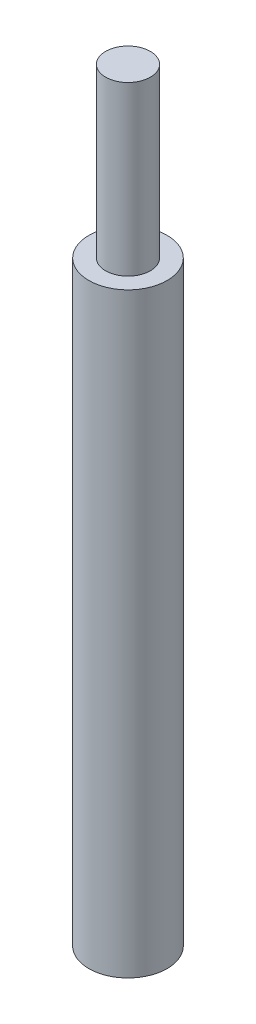
ISO-10303-21;
HEADER;
FILE_DESCRIPTION(('STEP AP214'),'2;1');
FILE_NAME('part.step','',(''),(''),'','','');
FILE_SCHEMA(('AUTOMOTIVE_DESIGN { 1 0 10303 214 1 1 1 1 }'));
ENDSEC;
DATA;
#1=APPLICATION_CONTEXT('core data for automotive mechanical design processes');
#2=APPLICATION_PROTOCOL_DEFINITION('international standard','automotive_design',2000,#1);
#3=PRODUCT_CONTEXT('',#1,'mechanical');
#4=PRODUCT('Part','Part','',(#3));
#5=PRODUCT_RELATED_PRODUCT_CATEGORY('part','',(#4));
#6=PRODUCT_DEFINITION_FORMATION('','',#4);
#7=PRODUCT_DEFINITION_CONTEXT('part definition',#1,'design');
#8=PRODUCT_DEFINITION('design','',#6,#7);
#9=PRODUCT_DEFINITION_SHAPE('','',#8);
#10=(LENGTH_UNIT() NAMED_UNIT(*) SI_UNIT(.MILLI.,.METRE.));
#11=(NAMED_UNIT(*) PLANE_ANGLE_UNIT() SI_UNIT($,.RADIAN.));
#12=(NAMED_UNIT(*) SI_UNIT($,.STERADIAN.) SOLID_ANGLE_UNIT());
#13=UNCERTAINTY_MEASURE_WITH_UNIT(LENGTH_MEASURE(1.E-05),#10,'distance_accuracy_value','');
#14=(GEOMETRIC_REPRESENTATION_CONTEXT(3) GLOBAL_UNCERTAINTY_ASSIGNED_CONTEXT((#13)) GLOBAL_UNIT_ASSIGNED_CONTEXT((#10,
#11,#12)) REPRESENTATION_CONTEXT('',''));
#15=CARTESIAN_POINT('',(0.,0.,0.));
#16=DIRECTION('',(0.,0.,1.));
#17=DIRECTION('',(1.,0.,0.));
#18=AXIS2_PLACEMENT_3D('',#15,#16,#17);
#19=CARTESIAN_POINT('',(0.,53.3,0.));
#20=DIRECTION('',(0.,-1.,0.));
#21=DIRECTION('',(0.,0.,-1.));
#22=AXIS2_PLACEMENT_3D('',#19,#20,#21);
#23=CYLINDRICAL_SURFACE('',#22,3.5);
#24=CARTESIAN_POINT('',(0.,53.3,0.));
#25=DIRECTION('',(0.,1.,0.));
#26=DIRECTION('',(0.,0.,1.));
#27=AXIS2_PLACEMENT_3D('',#24,#25,#26);
#28=CIRCLE('',#27,3.5);
#29=CARTESIAN_POINT('',(0.,53.3,3.5));
#30=VERTEX_POINT('',#29);
#31=EDGE_CURVE('E38',#30,#30,#28,.T.);
#32=ORIENTED_EDGE('',*,*,#31,.F.);
#33=EDGE_LOOP('',(#32));
#34=FACE_BOUND('',#33,.T.);
#35=CARTESIAN_POINT('',(0.,0.,0.));
#36=DIRECTION('',(0.,1.,0.));
#37=DIRECTION('',(0.,0.,1.));
#38=AXIS2_PLACEMENT_3D('',#35,#36,#37);
#39=CIRCLE('',#38,3.5);
#40=CARTESIAN_POINT('',(0.,0.,3.5));
#41=VERTEX_POINT('',#40);
#42=EDGE_CURVE('E34',#41,#41,#39,.T.);
#43=ORIENTED_EDGE('',*,*,#42,.T.);
#44=EDGE_LOOP('',(#43));
#45=FACE_BOUND('',#44,.T.);
#46=ADVANCED_FACE('F31',(#34,#45),#23,.T.);
#47=CARTESIAN_POINT('',(0.,53.3,0.));
#48=DIRECTION('',(0.,1.,0.));
#49=DIRECTION('',(0.,0.,1.));
#50=AXIS2_PLACEMENT_3D('',#47,#48,#49);
#51=PLANE('',#50);
#52=CARTESIAN_POINT('',(0.,53.3,0.));
#53=DIRECTION('',(0.,1.,0.));
#54=DIRECTION('',(0.,0.,1.));
#55=AXIS2_PLACEMENT_3D('',#52,#53,#54);
#56=CIRCLE('',#55,2.);
#57=CARTESIAN_POINT('',(0.,53.3,2.));
#58=VERTEX_POINT('',#57);
#59=EDGE_CURVE('E10',#58,#58,#56,.T.);
#60=ORIENTED_EDGE('',*,*,#59,.F.);
#61=EDGE_LOOP('',(#60));
#62=FACE_BOUND('',#61,.T.);
#63=ORIENTED_EDGE('',*,*,#31,.T.);
#64=EDGE_LOOP('',(#63));
#65=FACE_BOUND('',#64,.T.);
#66=ADVANCED_FACE('F55',(#62,#65),#51,.T.);
#67=CARTESIAN_POINT('',(0.,0.,0.));
#68=DIRECTION('',(0.,1.,0.));
#69=DIRECTION('',(0.,0.,1.));
#70=AXIS2_PLACEMENT_3D('',#67,#68,#69);
#71=PLANE('',#70);
#72=ORIENTED_EDGE('',*,*,#42,.F.);
#73=EDGE_LOOP('',(#72));
#74=FACE_BOUND('',#73,.T.);
#75=ADVANCED_FACE('F52',(#74),#71,.F.);
#76=CARTESIAN_POINT('',(0.,68.3,0.));
#77=DIRECTION('',(0.,-1.,0.));
#78=DIRECTION('',(0.,0.,-1.));
#79=AXIS2_PLACEMENT_3D('',#76,#77,#78);
#80=CYLINDRICAL_SURFACE('',#79,2.);
#81=CARTESIAN_POINT('',(0.,68.3,0.));
#82=DIRECTION('',(0.,1.,0.));
#83=DIRECTION('',(0.,0.,1.));
#84=AXIS2_PLACEMENT_3D('',#81,#82,#83);
#85=CIRCLE('',#84,2.);
#86=CARTESIAN_POINT('',(0.,68.3,2.));
#87=VERTEX_POINT('',#86);
#88=EDGE_CURVE('E44',#87,#87,#85,.T.);
#89=ORIENTED_EDGE('',*,*,#88,.F.);
#90=EDGE_LOOP('',(#89));
#91=FACE_BOUND('',#90,.T.);
#92=ORIENTED_EDGE('',*,*,#59,.T.);
#93=EDGE_LOOP('',(#92));
#94=FACE_BOUND('',#93,.T.);
#95=ADVANCED_FACE('F54',(#91,#94),#80,.T.);
#96=CARTESIAN_POINT('',(0.,68.3,0.));
#97=DIRECTION('',(0.,1.,0.));
#98=DIRECTION('',(0.,0.,1.));
#99=AXIS2_PLACEMENT_3D('',#96,#97,#98);
#100=PLANE('',#99);
#101=ORIENTED_EDGE('',*,*,#88,.T.);
#102=EDGE_LOOP('',(#101));
#103=FACE_BOUND('',#102,.T.);
#104=ADVANCED_FACE('F60',(#103),#100,.T.);
#105=CLOSED_SHELL('',(#46,#66,#75,#95,#104));
#106=MANIFOLD_SOLID_BREP('B2',#105);
#107=ADVANCED_BREP_SHAPE_REPRESENTATION('',(#18,#106),#14);
#108=SHAPE_DEFINITION_REPRESENTATION(#9,#107);
ENDSEC;
END-ISO-10303-21;
